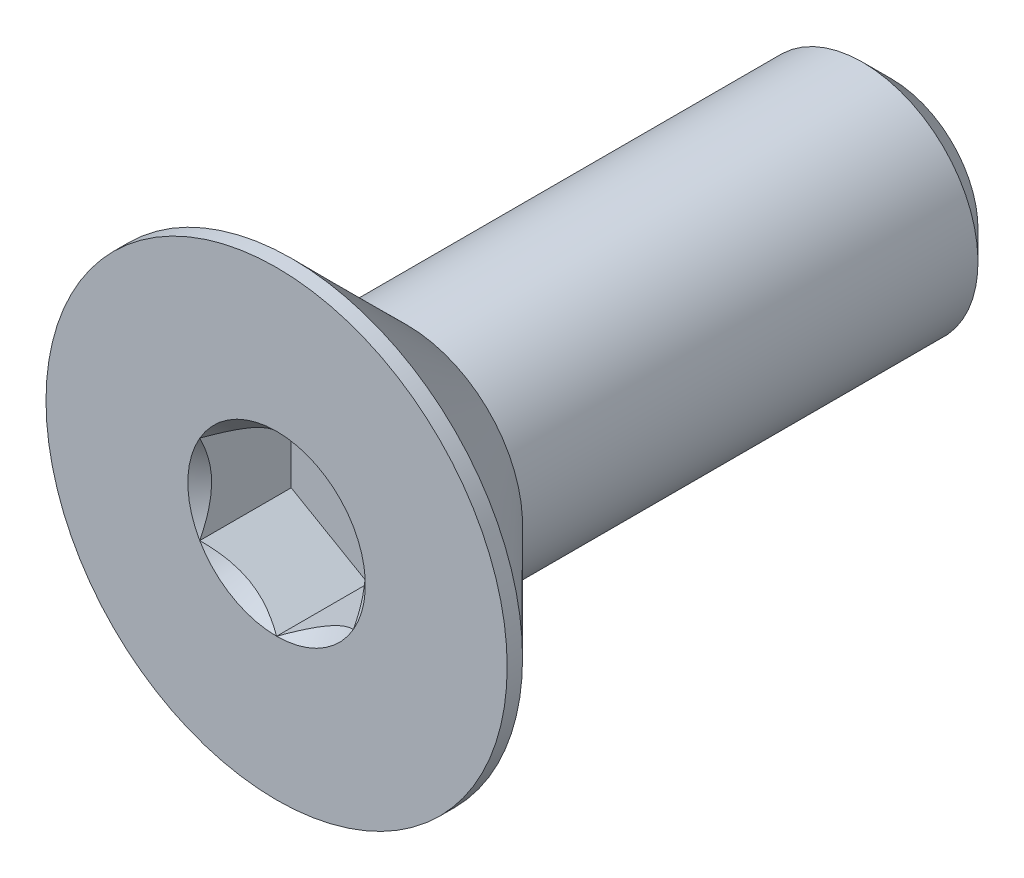
ISO-10303-21;
HEADER;
FILE_DESCRIPTION(('STEP AP214'),'2;1');
FILE_NAME('part.step','',(''),(''),'','','');
FILE_SCHEMA(('AUTOMOTIVE_DESIGN { 1 0 10303 214 1 1 1 1 }'));
ENDSEC;
DATA;
#1=APPLICATION_CONTEXT('core data for automotive mechanical design processes');
#2=APPLICATION_PROTOCOL_DEFINITION('international standard','automotive_design',2000,#1);
#3=PRODUCT_CONTEXT('',#1,'mechanical');
#4=PRODUCT('Part','Part','',(#3));
#5=PRODUCT_RELATED_PRODUCT_CATEGORY('part','',(#4));
#6=PRODUCT_DEFINITION_FORMATION('','',#4);
#7=PRODUCT_DEFINITION_CONTEXT('part definition',#1,'design');
#8=PRODUCT_DEFINITION('design','',#6,#7);
#9=PRODUCT_DEFINITION_SHAPE('','',#8);
#10=(LENGTH_UNIT() NAMED_UNIT(*) SI_UNIT(.MILLI.,.METRE.));
#11=(NAMED_UNIT(*) PLANE_ANGLE_UNIT() SI_UNIT($,.RADIAN.));
#12=(NAMED_UNIT(*) SI_UNIT($,.STERADIAN.) SOLID_ANGLE_UNIT());
#13=UNCERTAINTY_MEASURE_WITH_UNIT(LENGTH_MEASURE(1.E-05),#10,'distance_accuracy_value','');
#14=(GEOMETRIC_REPRESENTATION_CONTEXT(3) GLOBAL_UNCERTAINTY_ASSIGNED_CONTEXT((#13)) GLOBAL_UNIT_ASSIGNED_CONTEXT((#10,
#11,#12)) REPRESENTATION_CONTEXT('',''));
#15=CARTESIAN_POINT('',(0.,0.,0.));
#16=DIRECTION('',(0.,0.,1.));
#17=DIRECTION('',(1.,0.,0.));
#18=AXIS2_PLACEMENT_3D('',#15,#16,#17);
#19=CARTESIAN_POINT('',(0.,0.,-8.));
#20=DIRECTION('',(0.,0.,-1.));
#21=DIRECTION('',(0.,1.,0.));
#22=AXIS2_PLACEMENT_3D('',#19,#20,#21);
#23=CYLINDRICAL_SURFACE('',#22,1.5);
#24=CARTESIAN_POINT('',(0.,0.,-7.625));
#25=DIRECTION('',(0.,0.,-1.));
#26=DIRECTION('',(0.,1.,0.));
#27=AXIS2_PLACEMENT_3D('',#24,#25,#26);
#28=CIRCLE('',#27,1.5);
#29=CARTESIAN_POINT('',(0.,1.5,-7.625));
#30=VERTEX_POINT('',#29);
#31=EDGE_CURVE('E50',#30,#30,#28,.F.);
#32=ORIENTED_EDGE('',*,*,#31,.T.);
#33=EDGE_LOOP('',(#32));
#34=FACE_BOUND('',#33,.T.);
#35=CARTESIAN_POINT('',(0.,0.,-1.7));
#36=DIRECTION('',(0.,0.,1.));
#37=DIRECTION('',(0.,-1.,0.));
#38=AXIS2_PLACEMENT_3D('',#35,#36,#37);
#39=CIRCLE('',#38,1.5);
#40=CARTESIAN_POINT('',(0.,-1.5,-1.7));
#41=VERTEX_POINT('',#40);
#42=EDGE_CURVE('E168',#41,#41,#39,.T.);
#43=ORIENTED_EDGE('',*,*,#42,.F.);
#44=EDGE_LOOP('',(#43));
#45=FACE_BOUND('',#44,.T.);
#46=ADVANCED_FACE('F36',(#34,#45),#23,.T.);
#47=CARTESIAN_POINT('',(0.,-1.5,-8.));
#48=DIRECTION('',(0.,0.,-1.));
#49=DIRECTION('',(0.,1.,0.));
#50=AXIS2_PLACEMENT_3D('',#47,#48,#49);
#51=PLANE('',#50);
#52=CARTESIAN_POINT('',(0.,0.,-8.));
#53=DIRECTION('',(0.,0.,-1.));
#54=DIRECTION('',(0.,1.,0.));
#55=AXIS2_PLACEMENT_3D('',#52,#53,#54);
#56=CIRCLE('',#55,1.125);
#57=CARTESIAN_POINT('',(0.,1.12499999999999,-8.));
#58=VERTEX_POINT('',#57);
#59=EDGE_CURVE('E177',#58,#58,#56,.T.);
#60=ORIENTED_EDGE('',*,*,#59,.T.);
#61=EDGE_LOOP('',(#60));
#62=FACE_BOUND('',#61,.T.);
#63=ADVANCED_FACE('F187',(#62),#51,.T.);
#64=CARTESIAN_POINT('',(0.,0.,-8.));
#65=DIRECTION('',(0.,0.,1.));
#66=DIRECTION('',(0.,-1.,0.));
#67=AXIS2_PLACEMENT_3D('',#64,#65,#66);
#68=CONICAL_SURFACE('',#67,1.125,0.785398163397448);
#69=ORIENTED_EDGE('',*,*,#31,.F.);
#70=EDGE_LOOP('',(#69));
#71=FACE_BOUND('',#70,.T.);
#72=ORIENTED_EDGE('',*,*,#59,.F.);
#73=EDGE_LOOP('',(#72));
#74=FACE_BOUND('',#73,.T.);
#75=ADVANCED_FACE('F38',(#71,#74),#68,.T.);
#76=CARTESIAN_POINT('',(0.,0.,0.));
#77=DIRECTION('',(0.,0.,1.));
#78=DIRECTION('',(0.,-1.,0.));
#79=AXIS2_PLACEMENT_3D('',#76,#77,#78);
#80=CYLINDRICAL_SURFACE('',#79,3.);
#81=CARTESIAN_POINT('',(0.,0.,0.));
#82=DIRECTION('',(0.,0.,1.));
#83=DIRECTION('',(0.,-1.,0.));
#84=AXIS2_PLACEMENT_3D('',#81,#82,#83);
#85=CIRCLE('',#84,3.);
#86=CARTESIAN_POINT('',(0.,-3.,0.));
#87=VERTEX_POINT('',#86);
#88=EDGE_CURVE('E174',#87,#87,#85,.T.);
#89=ORIENTED_EDGE('',*,*,#88,.F.);
#90=EDGE_LOOP('',(#89));
#91=FACE_BOUND('',#90,.T.);
#92=CARTESIAN_POINT('',(0.,0.,-0.200000000000007));
#93=DIRECTION('',(0.,0.,1.));
#94=DIRECTION('',(0.,-1.,0.));
#95=AXIS2_PLACEMENT_3D('',#92,#93,#94);
#96=CIRCLE('',#95,3.);
#97=CARTESIAN_POINT('',(0.,-3.,-0.200000000000004));
#98=VERTEX_POINT('',#97);
#99=EDGE_CURVE('E171',#98,#98,#96,.T.);
#100=ORIENTED_EDGE('',*,*,#99,.T.);
#101=EDGE_LOOP('',(#100));
#102=FACE_BOUND('',#101,.T.);
#103=ADVANCED_FACE('F186',(#91,#102),#80,.T.);
#104=CARTESIAN_POINT('',(0.,0.,-1.7));
#105=DIRECTION('',(0.,0.,1.));
#106=DIRECTION('',(0.,-1.,0.));
#107=AXIS2_PLACEMENT_3D('',#104,#105,#106);
#108=CONICAL_SURFACE('',#107,1.5,0.78539816339745);
#109=ORIENTED_EDGE('',*,*,#99,.F.);
#110=EDGE_LOOP('',(#109));
#111=FACE_BOUND('',#110,.T.);
#112=ORIENTED_EDGE('',*,*,#42,.T.);
#113=EDGE_LOOP('',(#112));
#114=FACE_BOUND('',#113,.T.);
#115=ADVANCED_FACE('F197',(#111,#114),#108,.T.);
#116=CARTESIAN_POINT('',(0.,-1.5,0.));
#117=DIRECTION('',(0.,0.,1.));
#118=DIRECTION('',(0.,-1.,0.));
#119=AXIS2_PLACEMENT_3D('',#116,#117,#118);
#120=PLANE('',#119);
#121=CARTESIAN_POINT('',(0.,0.,0.));
#122=DIRECTION('',(0.,0.,1.));
#123=DIRECTION('',(1.,0.,0.));
#124=AXIS2_PLACEMENT_3D('',#121,#122,#123);
#125=CIRCLE('',#124,1.15470053837925);
#126=CARTESIAN_POINT('',(0.,-1.15470053837925,0.));
#127=VERTEX_POINT('',#126);
#128=CARTESIAN_POINT('',(1.,-0.577350269189626,0.));
#129=VERTEX_POINT('',#128);
#130=EDGE_CURVE('E96',#127,#129,#125,.T.);
#131=ORIENTED_EDGE('',*,*,#130,.F.);
#132=CARTESIAN_POINT('',(-1.,-0.577350269189626,0.));
#133=VERTEX_POINT('',#132);
#134=EDGE_CURVE('E56',#133,#127,#125,.T.);
#135=ORIENTED_EDGE('',*,*,#134,.F.);
#136=CARTESIAN_POINT('',(-1.,0.577350269189626,0.));
#137=VERTEX_POINT('',#136);
#138=EDGE_CURVE('E138',#137,#133,#125,.T.);
#139=ORIENTED_EDGE('',*,*,#138,.F.);
#140=CARTESIAN_POINT('',(0.,1.15470053837925,0.));
#141=VERTEX_POINT('',#140);
#142=EDGE_CURVE('E63',#141,#137,#125,.T.);
#143=ORIENTED_EDGE('',*,*,#142,.F.);
#144=CARTESIAN_POINT('',(1.,0.577350269189626,0.));
#145=VERTEX_POINT('',#144);
#146=EDGE_CURVE('E132',#145,#141,#125,.T.);
#147=ORIENTED_EDGE('',*,*,#146,.F.);
#148=EDGE_CURVE('E104',#129,#145,#125,.T.);
#149=ORIENTED_EDGE('',*,*,#148,.F.);
#150=EDGE_LOOP('',(#131,#135,#139,#143,#147,#149));
#151=FACE_BOUND('',#150,.T.);
#152=ORIENTED_EDGE('',*,*,#88,.T.);
#153=EDGE_LOOP('',(#152));
#154=FACE_BOUND('',#153,.T.);
#155=ADVANCED_FACE('F130',(#151,#154),#120,.T.);
#156=CARTESIAN_POINT('',(0.,0.,0.));
#157=DIRECTION('',(0.,0.,1.));
#158=DIRECTION('',(1.,0.,0.));
#159=AXIS2_PLACEMENT_3D('',#156,#157,#158);
#160=CONICAL_SURFACE('',#159,1.15470053837925,0.78539816339745);
#161=ORIENTED_EDGE('',*,*,#148,.T.);
#162=CARTESIAN_POINT('',(1.,-1.15147208646462,0.370385677513862));
#163=CARTESIAN_POINT('',(1.,-1.12343447988552,0.349219919873712));
#164=CARTESIAN_POINT('',(1.,-1.09524064850697,0.32826169217591));
#165=CARTESIAN_POINT('',(1.,-1.03847715644376,0.286846022235622));
#166=CARTESIAN_POINT('',(1.,-1.00990740382975,0.266388706123658));
#167=CARTESIAN_POINT('',(1.,-0.923120894333477,0.205604794954509));
#168=CARTESIAN_POINT('',(1.,-0.86425317375906,0.166192228961397));
#169=CARTESIAN_POINT('',(1.,-0.740809858258046,0.0888206642002048));
#170=CARTESIAN_POINT('',(1.,-0.676100255137808,0.051073039114342));
#171=CARTESIAN_POINT('',(1.,-0.543448939049125,-0.0179754124487085));
#172=CARTESIAN_POINT('',(1.,-0.475519112027779,-0.0492979721531351));
#173=CARTESIAN_POINT('',(1.,-0.373555850333529,-0.0876182211162057));
#174=CARTESIAN_POINT('',(1.,-0.341031989670908,-0.0986164083578443));
#175=CARTESIAN_POINT('',(1.,-0.275199079052294,-0.11800165785264));
#176=CARTESIAN_POINT('',(1.,-0.241889975173933,-0.126388540223301));
#177=CARTESIAN_POINT('',(1.,-0.175247517042993,-0.139974779280984));
#178=CARTESIAN_POINT('',(1.,-0.141925568218175,-0.145229209232033));
#179=CARTESIAN_POINT('',(1.,-0.0749144362322793,-0.152451313429109));
#180=CARTESIAN_POINT('',(1.,-0.0412251978501621,-0.154418486389493));
#181=CARTESIAN_POINT('',(1.,0.0249580992634207,-0.15491680160684));
#182=CARTESIAN_POINT('',(1.,0.0574512826460391,-0.153569732111367));
#183=CARTESIAN_POINT('',(1.,0.122148505701867,-0.147783515501016));
#184=CARTESIAN_POINT('',(1.,0.154352610132926,-0.143345079338465));
#185=CARTESIAN_POINT('',(1.,0.21879989886764,-0.131543169854797));
#186=CARTESIAN_POINT('',(1.,0.251033743268953,-0.124129458961492));
#187=CARTESIAN_POINT('',(1.,0.314797132354919,-0.106771057501325));
#188=CARTESIAN_POINT('',(1.,0.346326735731004,-0.0968265787111712));
#189=CARTESIAN_POINT('',(1.,0.445594187730205,-0.0617765174456643));
#190=CARTESIAN_POINT('',(1.,0.511919139476036,-0.0326791416432765));
#191=CARTESIAN_POINT('',(1.,0.641453244657532,0.0320153296865037));
#192=CARTESIAN_POINT('',(1.,0.704650133126344,0.0676357767152406));
#193=CARTESIAN_POINT('',(1.,0.825428490174986,0.141123901346934));
#194=CARTESIAN_POINT('',(1.,0.883132947867684,0.178791947135462));
#195=CARTESIAN_POINT('',(1.,0.968148853704565,0.237022852943162));
#196=CARTESIAN_POINT('',(1.,0.996120570380285,0.256638475762855));
#197=CARTESIAN_POINT('',(1.,1.05168177729901,0.29638851706127));
#198=CARTESIAN_POINT('',(1.,1.079271369977,0.316522792198831));
#199=CARTESIAN_POINT('',(1.,1.10670185346329,0.33687211907297));
#200=B_SPLINE_CURVE_WITH_KNOTS('',3,(#162,#163,#164,#165,#166,#167,#168,#169,#170,#171,#172,
#173,#174,#175,#176,#177,#178,#179,#180,#181,#182,#183,#184,#185,#186,#187,#188,#189,#190,#191,
#192,#193,#194,#195,#196,#197,#198,#199),.UNSPECIFIED.,.F.,.F.,(4,2,2,2,2,2,2,2,2,2,2,2,2,2,2,2,
2,2,4),(0.,0.105386459083291,0.210799187330125,0.423233611565469,0.647793540908504,
0.87158087773861,0.974493074181422,1.07741235827201,1.17846428203205,1.27953161415762,
1.37694086739611,1.47432772585408,1.57343322804293,1.67253043972851,1.88917353996827,
2.10660791038813,2.31323734249843,2.41572589232045,2.51818641476503),.UNSPECIFIED.);
#201=EDGE_CURVE('E11',#129,#145,#200,.T.);
#202=ORIENTED_EDGE('',*,*,#201,.F.);
#203=EDGE_LOOP('',(#161,#202));
#204=FACE_BOUND('',#203,.T.);
#205=ADVANCED_FACE('F108',(#204),#160,.F.);
#206=ORIENTED_EDGE('',*,*,#146,.T.);
#207=CARTESIAN_POINT('',(1.0002,0.577234799135788,0.00011548737261379));
#208=CARTESIAN_POINT('',(0.965817404992819,0.597085599618622,-0.0197220691742671));
#209=CARTESIAN_POINT('',(0.930859881860175,0.617268335009457,-0.0383949793611112));
#210=CARTESIAN_POINT('',(0.85957719704391,0.658423412276686,-0.0725852572768423));
#211=CARTESIAN_POINT('',(0.823245249471016,0.67939967198808,-0.0880835909765416));
#212=CARTESIAN_POINT('',(0.749983386196689,0.721697428470847,-0.114632692857735));
#213=CARTESIAN_POINT('',(0.713072148554585,0.743008141459637,-0.125750226003074));
#214=CARTESIAN_POINT('',(0.638437270689141,0.786098608286186,-0.142880134223818));
#215=CARTESIAN_POINT('',(0.600715911891364,0.807877044942281,-0.148905302533327));
#216=CARTESIAN_POINT('',(0.535707801582066,0.845409494928863,-0.154339445032506));
#217=CARTESIAN_POINT('',(0.508505628471828,0.861114676896602,-0.155143061683268));
#218=CARTESIAN_POINT('',(0.454153959330888,0.892494627706029,-0.153793300583113));
#219=CARTESIAN_POINT('',(0.427004476245124,0.908169389073954,-0.151639270452801));
#220=CARTESIAN_POINT('',(0.34594372267304,0.954969836969511,-0.140883027871529));
#221=CARTESIAN_POINT('',(0.292435859021572,0.985862616452447,-0.127985443584644));
#222=CARTESIAN_POINT('',(0.198523934856568,1.04008269114923,-0.0968592693978224));
#223=CARTESIAN_POINT('',(0.157679476328166,1.06366425027551,-0.0802622022981605));
#224=CARTESIAN_POINT('',(0.0775903626180563,1.1099037216352,-0.0428750753147073));
#225=CARTESIAN_POINT('',(0.0383409891295622,1.1325643579843,-0.0220986581825968));
#226=CARTESIAN_POINT('',(-0.00019999999999981,1.15481600843309,0.000115487372614069));
#227=B_SPLINE_CURVE_WITH_KNOTS('',3,(#207,#208,#209,#210,#211,#212,#213,#214,#215,#216,#217,
#218,#219,#220,#221,#222,#223,#224,#225,#226),.UNSPECIFIED.,.F.,.F.,(4,2,2,2,2,2,2,2,2,4),(0.,
0.133237676828559,0.26725222983449,0.3991370762693,0.530689603280768,0.624814864263846,
0.718960890149133,0.907306626112097,1.05710100361789,1.20641411519286),.UNSPECIFIED.);
#228=EDGE_CURVE('E134',#145,#141,#227,.T.);
#229=ORIENTED_EDGE('',*,*,#228,.F.);
#230=EDGE_LOOP('',(#206,#229));
#231=FACE_BOUND('',#230,.T.);
#232=ADVANCED_FACE('F278',(#231),#160,.F.);
#233=ORIENTED_EDGE('',*,*,#142,.T.);
#234=CARTESIAN_POINT('',(0.000200000000000086,1.15481600843309,0.000115487372613877));
#235=CARTESIAN_POINT('',(-0.0341825950071806,1.13496520795026,-0.0197220691742672));
#236=CARTESIAN_POINT('',(-0.0691401181398248,1.11478247255942,-0.0383949793611113));
#237=CARTESIAN_POINT('',(-0.14042280295609,1.07362739529219,-0.0725852572768423));
#238=CARTESIAN_POINT('',(-0.176754750528984,1.0526511355808,-0.0880835909765415));
#239=CARTESIAN_POINT('',(-0.250016613803311,1.01035337909803,-0.114632692857735));
#240=CARTESIAN_POINT('',(-0.286927851445414,0.989042666109241,-0.125750226003074));
#241=CARTESIAN_POINT('',(-0.361562729310859,0.945952199282691,-0.142880134223818));
#242=CARTESIAN_POINT('',(-0.399284088108636,0.924173762626597,-0.148905302533327));
#243=CARTESIAN_POINT('',(-0.464292198417934,0.886641312640015,-0.154339445032506));
#244=CARTESIAN_POINT('',(-0.491494371528172,0.870936130672276,-0.155143061683268));
#245=CARTESIAN_POINT('',(-0.545846040669112,0.839556179862848,-0.153793300583113));
#246=CARTESIAN_POINT('',(-0.572995523754876,0.823881418494924,-0.1516392704528));
#247=CARTESIAN_POINT('',(-0.65405627732696,0.777080970599367,-0.140883027871529));
#248=CARTESIAN_POINT('',(-0.707564140978428,0.74618819111643,-0.127985443584644));
#249=CARTESIAN_POINT('',(-0.801476065143432,0.69196811641965,-0.0968592693978227));
#250=CARTESIAN_POINT('',(-0.842320523671834,0.668386557293372,-0.0802622022981606));
#251=CARTESIAN_POINT('',(-0.922409637381944,0.622147085933682,-0.0428750753147073));
#252=CARTESIAN_POINT('',(-0.961659010870438,0.599486449584575,-0.0220986581825968));
#253=CARTESIAN_POINT('',(-1.0002,0.577234799135788,0.000115487372613852));
#254=B_SPLINE_CURVE_WITH_KNOTS('',3,(#234,#235,#236,#237,#238,#239,#240,#241,#242,#243,#244,
#245,#246,#247,#248,#249,#250,#251,#252,#253),.UNSPECIFIED.,.F.,.F.,(4,2,2,2,2,2,2,2,2,4),(0.,
0.133237676828559,0.26725222983449,0.3991370762693,0.530689603280768,0.624814864263846,
0.718960890149133,0.907306626112098,1.05710100361789,1.20641411519286),.UNSPECIFIED.);
#255=EDGE_CURVE('E137',#141,#137,#254,.T.);
#256=ORIENTED_EDGE('',*,*,#255,.F.);
#257=EDGE_LOOP('',(#233,#256));
#258=FACE_BOUND('',#257,.T.);
#259=ADVANCED_FACE('F274',(#258),#160,.F.);
#260=ORIENTED_EDGE('',*,*,#138,.T.);
#261=CARTESIAN_POINT('',(-1.,-1.15147208646462,0.370385677513861));
#262=CARTESIAN_POINT('',(-1.,-1.12343447988552,0.349219919873711));
#263=CARTESIAN_POINT('',(-1.,-1.09524064850697,0.328261692175909));
#264=CARTESIAN_POINT('',(-1.,-1.03847715644376,0.286846022235621));
#265=CARTESIAN_POINT('',(-1.,-1.00990740382975,0.266388706123658));
#266=CARTESIAN_POINT('',(-1.,-0.923120894333477,0.205604794954509));
#267=CARTESIAN_POINT('',(-1.,-0.864253173759059,0.166192228961397));
#268=CARTESIAN_POINT('',(-1.,-0.740809858258045,0.0888206642002045));
#269=CARTESIAN_POINT('',(-1.,-0.676100255137807,0.0510730391143416));
#270=CARTESIAN_POINT('',(-1.,-0.543448939049124,-0.0179754124487089));
#271=CARTESIAN_POINT('',(-1.,-0.475519112027779,-0.0492979721531352));
#272=CARTESIAN_POINT('',(-1.,-0.373555850333529,-0.0876182211162056));
#273=CARTESIAN_POINT('',(-1.,-0.341031989670908,-0.0986164083578442));
#274=CARTESIAN_POINT('',(-1.,-0.275199079052293,-0.11800165785264));
#275=CARTESIAN_POINT('',(-1.,-0.241889975173933,-0.126388540223301));
#276=CARTESIAN_POINT('',(-1.,-0.175247517042993,-0.139974779280984));
#277=CARTESIAN_POINT('',(-1.,-0.141925568218175,-0.145229209232033));
#278=CARTESIAN_POINT('',(-1.,-0.0749144362322789,-0.152451313429108));
#279=CARTESIAN_POINT('',(-1.,-0.0412251978501617,-0.154418486389493));
#280=CARTESIAN_POINT('',(-1.,0.0249580992634211,-0.15491680160684));
#281=CARTESIAN_POINT('',(-1.,0.0574512826460394,-0.153569732111366));
#282=CARTESIAN_POINT('',(-1.,0.122148505701867,-0.147783515501016));
#283=CARTESIAN_POINT('',(-1.,0.154352610132926,-0.143345079338465));
#284=CARTESIAN_POINT('',(-1.,0.21879989886764,-0.131543169854797));
#285=CARTESIAN_POINT('',(-1.,0.251033743268953,-0.124129458961491));
#286=CARTESIAN_POINT('',(-1.,0.314797132354919,-0.106771057501325));
#287=CARTESIAN_POINT('',(-1.,0.346326735731004,-0.0968265787111709));
#288=CARTESIAN_POINT('',(-1.,0.445594187730205,-0.0617765174456641));
#289=CARTESIAN_POINT('',(-1.,0.511919139476036,-0.0326791416432762));
#290=CARTESIAN_POINT('',(-1.,0.641453244657532,0.032015329686504));
#291=CARTESIAN_POINT('',(-1.,0.704650133126344,0.0676357767152409));
#292=CARTESIAN_POINT('',(-1.,0.825428490174986,0.141123901346934));
#293=CARTESIAN_POINT('',(-1.,0.883132947867684,0.178791947135462));
#294=CARTESIAN_POINT('',(-1.,0.968148853704565,0.237022852943162));
#295=CARTESIAN_POINT('',(-1.,0.996120570380285,0.256638475762855));
#296=CARTESIAN_POINT('',(-1.,1.05168177729901,0.29638851706127));
#297=CARTESIAN_POINT('',(-1.,1.079271369977,0.316522792198831));
#298=CARTESIAN_POINT('',(-1.,1.10670185346329,0.336872119072971));
#299=B_SPLINE_CURVE_WITH_KNOTS('',3,(#261,#262,#263,#264,#265,#266,#267,#268,#269,#270,#271,
#272,#273,#274,#275,#276,#277,#278,#279,#280,#281,#282,#283,#284,#285,#286,#287,#288,#289,#290,
#291,#292,#293,#294,#295,#296,#297,#298),.UNSPECIFIED.,.F.,.F.,(4,2,2,2,2,2,2,2,2,2,2,2,2,2,2,2,
2,2,4),(0.,0.105386459083291,0.210799187330124,0.423233611565469,0.647793540908503,
0.87158087773861,0.974493074181421,1.07741235827201,1.17846428203205,1.27953161415762,
1.3769408673961,1.47432772585408,1.57343322804293,1.67253043972851,1.88917353996827,
2.10660791038813,2.31323734249843,2.41572589232045,2.51818641476503),.UNSPECIFIED.);
#300=EDGE_CURVE('E144',#137,#133,#299,.F.);
#301=ORIENTED_EDGE('',*,*,#300,.F.);
#302=EDGE_LOOP('',(#260,#301));
#303=FACE_BOUND('',#302,.T.);
#304=ADVANCED_FACE('F142',(#303),#160,.F.);
#305=ORIENTED_EDGE('',*,*,#134,.T.);
#306=CARTESIAN_POINT('',(-1.0002,-0.577234799135788,0.000115487372614006));
#307=CARTESIAN_POINT('',(-0.965817404992819,-0.597085599618622,-0.019722069174267));
#308=CARTESIAN_POINT('',(-0.930859881860175,-0.617268335009457,-0.0383949793611112));
#309=CARTESIAN_POINT('',(-0.85957719704391,-0.658423412276686,-0.0725852572768421));
#310=CARTESIAN_POINT('',(-0.823245249471016,-0.67939967198808,-0.0880835909765414));
#311=CARTESIAN_POINT('',(-0.749983386196689,-0.721697428470846,-0.114632692857735));
#312=CARTESIAN_POINT('',(-0.713072148554586,-0.743008141459637,-0.125750226003074));
#313=CARTESIAN_POINT('',(-0.638437270689141,-0.786098608286186,-0.142880134223818));
#314=CARTESIAN_POINT('',(-0.600715911891364,-0.807877044942281,-0.148905302533327));
#315=CARTESIAN_POINT('',(-0.535707801582066,-0.845409494928863,-0.154339445032506));
#316=CARTESIAN_POINT('',(-0.508505628471828,-0.861114676896602,-0.155143061683268));
#317=CARTESIAN_POINT('',(-0.454153959330888,-0.892494627706029,-0.153793300583113));
#318=CARTESIAN_POINT('',(-0.427004476245124,-0.908169389073954,-0.151639270452801));
#319=CARTESIAN_POINT('',(-0.34594372267304,-0.954969836969511,-0.140883027871529));
#320=CARTESIAN_POINT('',(-0.292435859021572,-0.985862616452447,-0.127985443584644));
#321=CARTESIAN_POINT('',(-0.198523934856568,-1.04008269114923,-0.0968592693978225));
#322=CARTESIAN_POINT('',(-0.157679476328166,-1.06366425027551,-0.0802622022981606));
#323=CARTESIAN_POINT('',(-0.0775903626180563,-1.1099037216352,-0.0428750753147074));
#324=CARTESIAN_POINT('',(-0.0383409891295623,-1.1325643579843,-0.022098658182597));
#325=CARTESIAN_POINT('',(0.000199999999999814,-1.15481600843309,0.000115487372613911));
#326=B_SPLINE_CURVE_WITH_KNOTS('',3,(#306,#307,#308,#309,#310,#311,#312,#313,#314,#315,#316,
#317,#318,#319,#320,#321,#322,#323,#324,#325),.UNSPECIFIED.,.F.,.F.,(4,2,2,2,2,2,2,2,2,4),(0.,
0.133237676828559,0.26725222983449,0.3991370762693,0.530689603280768,0.624814864263846,
0.718960890149133,0.907306626112098,1.05710100361789,1.20641411519286),.UNSPECIFIED.);
#327=EDGE_CURVE('E120',#133,#127,#326,.T.);
#328=ORIENTED_EDGE('',*,*,#327,.F.);
#329=EDGE_LOOP('',(#305,#328));
#330=FACE_BOUND('',#329,.T.);
#331=ADVANCED_FACE('F226',(#330),#160,.F.);
#332=ORIENTED_EDGE('',*,*,#130,.T.);
#333=CARTESIAN_POINT('',(-0.000200000000000066,-1.15481600843309,0.000115487372613877));
#334=CARTESIAN_POINT('',(0.0341825950071807,-1.13496520795026,-0.019722069174267));
#335=CARTESIAN_POINT('',(0.0691401181398249,-1.11478247255942,-0.0383949793611111));
#336=CARTESIAN_POINT('',(0.14042280295609,-1.07362739529219,-0.0725852572768421));
#337=CARTESIAN_POINT('',(0.176754750528984,-1.0526511355808,-0.0880835909765414));
#338=CARTESIAN_POINT('',(0.250016613803311,-1.01035337909803,-0.114632692857735));
#339=CARTESIAN_POINT('',(0.286927851445414,-0.989042666109241,-0.125750226003074));
#340=CARTESIAN_POINT('',(0.361562729310859,-0.945952199282691,-0.142880134223818));
#341=CARTESIAN_POINT('',(0.399284088108636,-0.924173762626597,-0.148905302533327));
#342=CARTESIAN_POINT('',(0.464292198417934,-0.886641312640015,-0.154339445032506));
#343=CARTESIAN_POINT('',(0.491494371528172,-0.870936130672276,-0.155143061683268));
#344=CARTESIAN_POINT('',(0.545846040669112,-0.839556179862848,-0.153793300583113));
#345=CARTESIAN_POINT('',(0.572995523754876,-0.823881418494924,-0.151639270452801));
#346=CARTESIAN_POINT('',(0.65405627732696,-0.777080970599367,-0.140883027871529));
#347=CARTESIAN_POINT('',(0.707564140978428,-0.74618819111643,-0.127985443584644));
#348=CARTESIAN_POINT('',(0.801476065143432,-0.69196811641965,-0.0968592693978225));
#349=CARTESIAN_POINT('',(0.842320523671834,-0.668386557293372,-0.0802622022981604));
#350=CARTESIAN_POINT('',(0.922409637381943,-0.622147085933682,-0.042875075314707));
#351=CARTESIAN_POINT('',(0.961659010870438,-0.599486449584576,-0.0220986581825965));
#352=CARTESIAN_POINT('',(1.0002,-0.577234799135788,0.000115487372613976));
#353=B_SPLINE_CURVE_WITH_KNOTS('',3,(#333,#334,#335,#336,#337,#338,#339,#340,#341,#342,#343,
#344,#345,#346,#347,#348,#349,#350,#351,#352),.UNSPECIFIED.,.F.,.F.,(4,2,2,2,2,2,2,2,2,4),(0.,
0.133237676828559,0.26725222983449,0.3991370762693,0.530689603280768,0.624814864263846,
0.718960890149133,0.907306626112097,1.05710100361789,1.20641411519286),.UNSPECIFIED.);
#354=EDGE_CURVE('E100',#127,#129,#353,.T.);
#355=ORIENTED_EDGE('',*,*,#354,.F.);
#356=EDGE_LOOP('',(#332,#355));
#357=FACE_BOUND('',#356,.T.);
#358=ADVANCED_FACE('F98',(#357),#160,.F.);
#359=CARTESIAN_POINT('',(1.,-0.577350269189626,-1.19));
#360=DIRECTION('',(0.,0.,1.));
#361=DIRECTION('',(1.,0.,0.));
#362=AXIS2_PLACEMENT_3D('',#359,#360,#361);
#363=PLANE('',#362);
#364=DIRECTION('',(0.866025403784439,0.5,0.));
#365=VECTOR('',#364,1.);
#366=CARTESIAN_POINT('',(0.,-1.15470053837925,-1.19));
#367=LINE('',#366,#365);
#368=CARTESIAN_POINT('',(0.,-1.15470053837925,-1.19));
#369=VERTEX_POINT('',#368);
#370=CARTESIAN_POINT('',(1.,-0.577350269189626,-1.19));
#371=VERTEX_POINT('',#370);
#372=EDGE_CURVE('E119',#369,#371,#367,.T.);
#373=ORIENTED_EDGE('',*,*,#372,.T.);
#374=DIRECTION('',(0.,1.,0.));
#375=VECTOR('',#374,1.);
#376=CARTESIAN_POINT('',(1.,-0.577350269189626,-1.19));
#377=LINE('',#376,#375);
#378=CARTESIAN_POINT('',(1.,0.577350269189626,-1.19));
#379=VERTEX_POINT('',#378);
#380=EDGE_CURVE('E124',#371,#379,#377,.T.);
#381=ORIENTED_EDGE('',*,*,#380,.T.);
#382=DIRECTION('',(-0.866025403784439,0.5,0.));
#383=VECTOR('',#382,1.);
#384=CARTESIAN_POINT('',(1.,0.577350269189626,-1.19));
#385=LINE('',#384,#383);
#386=CARTESIAN_POINT('',(0.,1.15470053837925,-1.19));
#387=VERTEX_POINT('',#386);
#388=EDGE_CURVE('E260',#379,#387,#385,.T.);
#389=ORIENTED_EDGE('',*,*,#388,.T.);
#390=DIRECTION('',(-0.866025403784439,-0.5,0.));
#391=VECTOR('',#390,1.);
#392=CARTESIAN_POINT('',(0.,1.15470053837925,-1.19));
#393=LINE('',#392,#391);
#394=CARTESIAN_POINT('',(-1.,0.577350269189626,-1.19));
#395=VERTEX_POINT('',#394);
#396=EDGE_CURVE('E262',#387,#395,#393,.T.);
#397=ORIENTED_EDGE('',*,*,#396,.T.);
#398=DIRECTION('',(0.,-1.,0.));
#399=VECTOR('',#398,1.);
#400=CARTESIAN_POINT('',(-1.,0.577350269189626,-1.19));
#401=LINE('',#400,#399);
#402=CARTESIAN_POINT('',(-1.,-0.577350269189626,-1.19));
#403=VERTEX_POINT('',#402);
#404=EDGE_CURVE('E159',#395,#403,#401,.T.);
#405=ORIENTED_EDGE('',*,*,#404,.T.);
#406=DIRECTION('',(0.866025403784439,-0.5,0.));
#407=VECTOR('',#406,1.);
#408=CARTESIAN_POINT('',(-1.,-0.577350269189626,-1.19));
#409=LINE('',#408,#407);
#410=EDGE_CURVE('E127',#403,#369,#409,.T.);
#411=ORIENTED_EDGE('',*,*,#410,.T.);
#412=EDGE_LOOP('',(#373,#381,#389,#397,#405,#411));
#413=FACE_BOUND('',#412,.T.);
#414=ADVANCED_FACE('F225',(#413),#363,.T.);
#415=CARTESIAN_POINT('',(1.,-0.577350269189626,-1.19));
#416=DIRECTION('',(1.,0.,0.));
#417=DIRECTION('',(0.,0.,-1.));
#418=AXIS2_PLACEMENT_3D('',#415,#416,#417);
#419=PLANE('',#418);
#420=DIRECTION('',(0.,0.,1.));
#421=VECTOR('',#420,1.);
#422=CARTESIAN_POINT('',(1.,-0.577350269189626,-1.19));
#423=LINE('',#422,#421);
#424=EDGE_CURVE('E116',#371,#129,#423,.T.);
#425=ORIENTED_EDGE('',*,*,#424,.T.);
#426=ORIENTED_EDGE('',*,*,#201,.T.);
#427=DIRECTION('',(0.,0.,1.));
#428=VECTOR('',#427,1.);
#429=CARTESIAN_POINT('',(1.,0.577350269189626,-1.19));
#430=LINE('',#429,#428);
#431=EDGE_CURVE('E126',#379,#145,#430,.T.);
#432=ORIENTED_EDGE('',*,*,#431,.F.);
#433=ORIENTED_EDGE('',*,*,#380,.F.);
#434=EDGE_LOOP('',(#425,#426,#432,#433));
#435=FACE_BOUND('',#434,.T.);
#436=ADVANCED_FACE('F122',(#435),#419,.F.);
#437=CARTESIAN_POINT('',(1.,0.577350269189626,-1.19));
#438=DIRECTION('',(0.5,0.866025403784439,0.));
#439=DIRECTION('',(-0.866025403784439,0.5,0.));
#440=AXIS2_PLACEMENT_3D('',#437,#438,#439);
#441=PLANE('',#440);
#442=ORIENTED_EDGE('',*,*,#431,.T.);
#443=ORIENTED_EDGE('',*,*,#228,.T.);
#444=DIRECTION('',(0.,0.,1.));
#445=VECTOR('',#444,1.);
#446=CARTESIAN_POINT('',(0.,1.15470053837925,-1.19));
#447=LINE('',#446,#445);
#448=EDGE_CURVE('E155',#387,#141,#447,.T.);
#449=ORIENTED_EDGE('',*,*,#448,.F.);
#450=ORIENTED_EDGE('',*,*,#388,.F.);
#451=EDGE_LOOP('',(#442,#443,#449,#450));
#452=FACE_BOUND('',#451,.T.);
#453=ADVANCED_FACE('F251',(#452),#441,.F.);
#454=CARTESIAN_POINT('',(0.,1.15470053837925,-1.19));
#455=DIRECTION('',(-0.5,0.866025403784439,0.));
#456=DIRECTION('',(-0.866025403784439,-0.5,0.));
#457=AXIS2_PLACEMENT_3D('',#454,#455,#456);
#458=PLANE('',#457);
#459=ORIENTED_EDGE('',*,*,#448,.T.);
#460=ORIENTED_EDGE('',*,*,#255,.T.);
#461=DIRECTION('',(0.,0.,1.));
#462=VECTOR('',#461,1.);
#463=CARTESIAN_POINT('',(-1.,0.577350269189626,-1.19));
#464=LINE('',#463,#462);
#465=EDGE_CURVE('E153',#395,#137,#464,.T.);
#466=ORIENTED_EDGE('',*,*,#465,.F.);
#467=ORIENTED_EDGE('',*,*,#396,.F.);
#468=EDGE_LOOP('',(#459,#460,#466,#467));
#469=FACE_BOUND('',#468,.T.);
#470=ADVANCED_FACE('F151',(#469),#458,.F.);
#471=CARTESIAN_POINT('',(-1.,0.577350269189626,-1.19));
#472=DIRECTION('',(-1.,0.,0.));
#473=DIRECTION('',(0.,0.,1.));
#474=AXIS2_PLACEMENT_3D('',#471,#472,#473);
#475=PLANE('',#474);
#476=ORIENTED_EDGE('',*,*,#465,.T.);
#477=ORIENTED_EDGE('',*,*,#300,.T.);
#478=DIRECTION('',(0.,0.,1.));
#479=VECTOR('',#478,1.);
#480=CARTESIAN_POINT('',(-1.,-0.577350269189626,-1.19));
#481=LINE('',#480,#479);
#482=EDGE_CURVE('E161',#403,#133,#481,.T.);
#483=ORIENTED_EDGE('',*,*,#482,.F.);
#484=ORIENTED_EDGE('',*,*,#404,.F.);
#485=EDGE_LOOP('',(#476,#477,#483,#484));
#486=FACE_BOUND('',#485,.T.);
#487=ADVANCED_FACE('F157',(#486),#475,.F.);
#488=CARTESIAN_POINT('',(-1.,-0.577350269189626,-1.19));
#489=DIRECTION('',(-0.5,-0.866025403784439,0.));
#490=DIRECTION('',(0.866025403784439,-0.5,0.));
#491=AXIS2_PLACEMENT_3D('',#488,#489,#490);
#492=PLANE('',#491);
#493=ORIENTED_EDGE('',*,*,#482,.T.);
#494=ORIENTED_EDGE('',*,*,#327,.T.);
#495=DIRECTION('',(0.,0.,1.));
#496=VECTOR('',#495,1.);
#497=CARTESIAN_POINT('',(0.,-1.15470053837925,-1.19));
#498=LINE('',#497,#496);
#499=EDGE_CURVE('E118',#369,#127,#498,.T.);
#500=ORIENTED_EDGE('',*,*,#499,.F.);
#501=ORIENTED_EDGE('',*,*,#410,.F.);
#502=EDGE_LOOP('',(#493,#494,#500,#501));
#503=FACE_BOUND('',#502,.T.);
#504=ADVANCED_FACE('F207',(#503),#492,.F.);
#505=CARTESIAN_POINT('',(0.,-1.15470053837925,-1.19));
#506=DIRECTION('',(0.5,-0.866025403784439,0.));
#507=DIRECTION('',(0.866025403784439,0.5,0.));
#508=AXIS2_PLACEMENT_3D('',#505,#506,#507);
#509=PLANE('',#508);
#510=ORIENTED_EDGE('',*,*,#499,.T.);
#511=ORIENTED_EDGE('',*,*,#354,.T.);
#512=ORIENTED_EDGE('',*,*,#424,.F.);
#513=ORIENTED_EDGE('',*,*,#372,.F.);
#514=EDGE_LOOP('',(#510,#511,#512,#513));
#515=FACE_BOUND('',#514,.T.);
#516=ADVANCED_FACE('F114',(#515),#509,.F.);
#517=CLOSED_SHELL('',(#46,#63,#75,#103,#115,#155,#205,#232,#259,#304,#331,#358,#414,#436,#453,
#470,#487,#504,#516));
#518=MANIFOLD_SOLID_BREP('B2',#517);
#519=ADVANCED_BREP_SHAPE_REPRESENTATION('',(#18,#518),#14);
#520=SHAPE_DEFINITION_REPRESENTATION(#9,#519);
ENDSEC;
END-ISO-10303-21;
